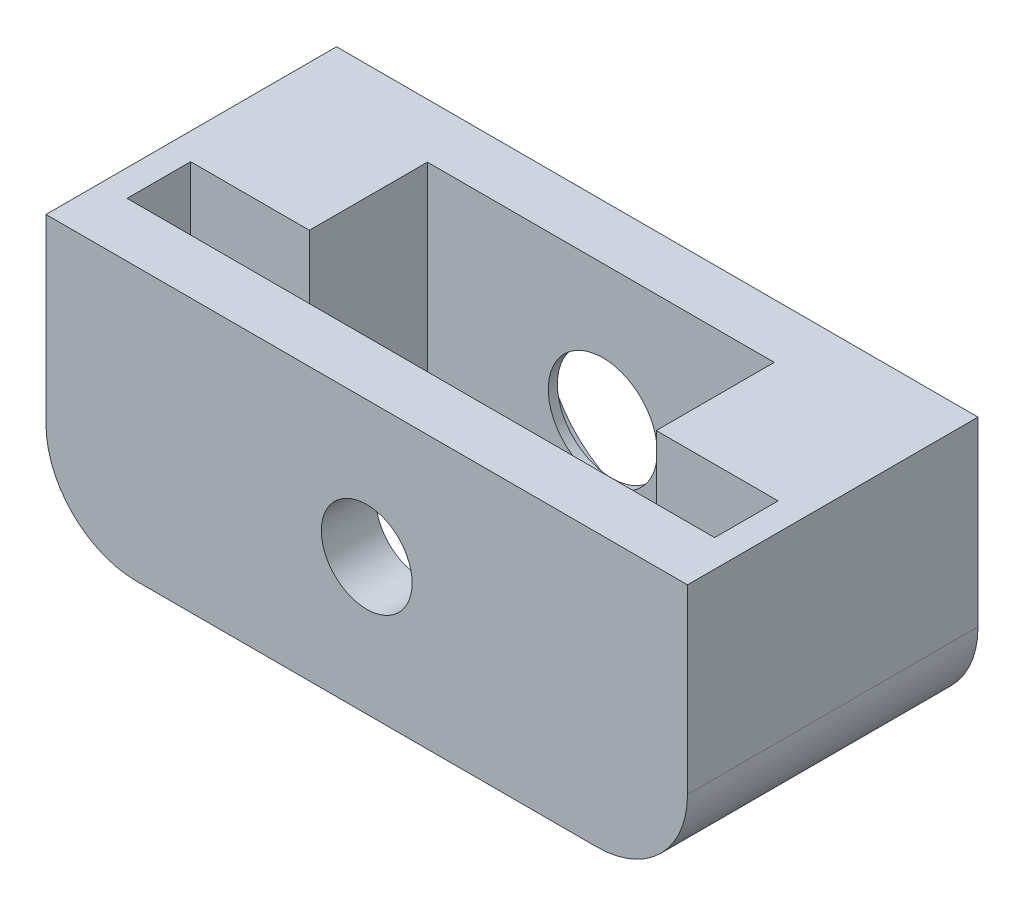
ISO-10303-21;
HEADER;
FILE_DESCRIPTION(('STEP AP214'),'2;1');
FILE_NAME('part.step','',(''),(''),'','','');
FILE_SCHEMA(('AUTOMOTIVE_DESIGN { 1 0 10303 214 1 1 1 1 }'));
ENDSEC;
DATA;
#1=APPLICATION_CONTEXT('core data for automotive mechanical design processes');
#2=APPLICATION_PROTOCOL_DEFINITION('international standard','automotive_design',2000,#1);
#3=PRODUCT_CONTEXT('',#1,'mechanical');
#4=PRODUCT('Part','Part','',(#3));
#5=PRODUCT_RELATED_PRODUCT_CATEGORY('part','',(#4));
#6=PRODUCT_DEFINITION_FORMATION('','',#4);
#7=PRODUCT_DEFINITION_CONTEXT('part definition',#1,'design');
#8=PRODUCT_DEFINITION('design','',#6,#7);
#9=PRODUCT_DEFINITION_SHAPE('','',#8);
#10=(LENGTH_UNIT() NAMED_UNIT(*) SI_UNIT(.MILLI.,.METRE.));
#11=(NAMED_UNIT(*) PLANE_ANGLE_UNIT() SI_UNIT($,.RADIAN.));
#12=(NAMED_UNIT(*) SI_UNIT($,.STERADIAN.) SOLID_ANGLE_UNIT());
#13=UNCERTAINTY_MEASURE_WITH_UNIT(LENGTH_MEASURE(1.E-05),#10,'distance_accuracy_value','');
#14=(GEOMETRIC_REPRESENTATION_CONTEXT(3) GLOBAL_UNCERTAINTY_ASSIGNED_CONTEXT((#13)) GLOBAL_UNIT_ASSIGNED_CONTEXT((#10,
#11,#12)) REPRESENTATION_CONTEXT('',''));
#15=CARTESIAN_POINT('',(0.,0.,0.));
#16=DIRECTION('',(0.,0.,1.));
#17=DIRECTION('',(1.,0.,0.));
#18=AXIS2_PLACEMENT_3D('',#15,#16,#17);
#19=CARTESIAN_POINT('',(7.23032744787133E-12,1.60982338570648E-12,-50.));
#20=DIRECTION('',(0.,0.,1.));
#21=DIRECTION('',(1.,0.,0.));
#22=AXIS2_PLACEMENT_3D('',#19,#20,#21);
#23=CYLINDRICAL_SURFACE('',#22,6.);
#24=CARTESIAN_POINT('',(7.23032744787133E-12,1.60982338570648E-12,-20.));
#25=DIRECTION('',(0.,0.,1.));
#26=DIRECTION('',(1.,0.,0.));
#27=AXIS2_PLACEMENT_3D('',#24,#25,#26);
#28=CIRCLE('',#27,6.);
#29=CARTESIAN_POINT('',(6.00000000000723,1.60982338570648E-12,-20.));
#30=VERTEX_POINT('',#29);
#31=EDGE_CURVE('E196',#30,#30,#28,.T.);
#32=ORIENTED_EDGE('',*,*,#31,.T.);
#33=EDGE_LOOP('',(#32));
#34=FACE_BOUND('',#33,.T.);
#35=CARTESIAN_POINT('',(7.23032744787133E-12,1.60982338570648E-12,-21.));
#36=DIRECTION('',(0.,0.,-1.));
#37=DIRECTION('',(-1.,0.,0.));
#38=AXIS2_PLACEMENT_3D('',#35,#36,#37);
#39=CIRCLE('',#38,6.);
#40=CARTESIAN_POINT('',(-5.99999999999277,1.60982338570648E-12,-21.));
#41=VERTEX_POINT('',#40);
#42=EDGE_CURVE('E39',#41,#41,#39,.F.);
#43=ORIENTED_EDGE('',*,*,#42,.F.);
#44=EDGE_LOOP('',(#43));
#45=FACE_BOUND('',#44,.T.);
#46=ADVANCED_FACE('F35',(#34,#45),#23,.F.);
#47=CARTESIAN_POINT('',(0.,0.,0.));
#48=DIRECTION('',(0.,0.,1.));
#49=DIRECTION('',(1.,0.,0.));
#50=AXIS2_PLACEMENT_3D('',#47,#48,#49);
#51=PLANE('',#50);
#52=CARTESIAN_POINT('',(0.,0.,0.));
#53=DIRECTION('',(0.,0.,-1.));
#54=DIRECTION('',(-1.,0.,0.));
#55=AXIS2_PLACEMENT_3D('',#52,#53,#54);
#56=CIRCLE('',#55,5.);
#57=CARTESIAN_POINT('',(-5.,0.,0.));
#58=VERTEX_POINT('',#57);
#59=EDGE_CURVE('E266',#58,#58,#56,.T.);
#60=ORIENTED_EDGE('',*,*,#59,.F.);
#61=EDGE_LOOP('',(#60));
#62=FACE_BOUND('',#61,.T.);
#63=DIRECTION('',(0.,-1.,0.));
#64=VECTOR('',#63,1.);
#65=CARTESIAN_POINT('',(-32.4010170504442,0.,0.));
#66=LINE('',#65,#64);
#67=CARTESIAN_POINT('',(-32.4010170504442,15.,0.));
#68=VERTEX_POINT('',#67);
#69=CARTESIAN_POINT('',(-32.4010170504442,-12.0710678118655,0.));
#70=VERTEX_POINT('',#69);
#71=EDGE_CURVE('E244',#68,#70,#66,.T.);
#72=ORIENTED_EDGE('',*,*,#71,.F.);
#73=DIRECTION('',(-1.,0.,0.));
#74=VECTOR('',#73,1.);
#75=CARTESIAN_POINT('',(-35.3299492385787,15.,0.));
#76=LINE('',#75,#74);
#77=CARTESIAN_POINT('',(32.3169988456541,15.,0.));
#78=VERTEX_POINT('',#77);
#79=EDGE_CURVE('E272',#78,#68,#76,.T.);
#80=ORIENTED_EDGE('',*,*,#79,.F.);
#81=DIRECTION('',(0.00310360125898917,-0.999995183818015,0.));
#82=VECTOR('',#81,1.);
#83=CARTESIAN_POINT('',(32.3632413519806,0.100443080357132,0.));
#84=LINE('',#83,#82);
#85=CARTESIAN_POINT('',(32.4010170504442,-12.0710678118655,0.));
#86=VERTEX_POINT('',#85);
#87=EDGE_CURVE('E256',#78,#86,#84,.T.);
#88=ORIENTED_EDGE('',*,*,#87,.T.);
#89=CARTESIAN_POINT('',(25.3299492385787,-5.,0.));
#90=DIRECTION('',(0.,0.,1.));
#91=DIRECTION('',(1.,0.,0.));
#92=AXIS2_PLACEMENT_3D('',#89,#90,#91);
#93=CIRCLE('',#92,10.);
#94=CARTESIAN_POINT('',(25.3299492385787,-15.,0.));
#95=VERTEX_POINT('',#94);
#96=EDGE_CURVE('E294',#86,#95,#93,.F.);
#97=ORIENTED_EDGE('',*,*,#96,.T.);
#98=DIRECTION('',(1.,0.,0.));
#99=VECTOR('',#98,1.);
#100=CARTESIAN_POINT('',(-35.3299492385787,-15.,0.));
#101=LINE('',#100,#99);
#102=CARTESIAN_POINT('',(-25.3299492385787,-15.,0.));
#103=VERTEX_POINT('',#102);
#104=EDGE_CURVE('E276',#103,#95,#101,.T.);
#105=ORIENTED_EDGE('',*,*,#104,.F.);
#106=CARTESIAN_POINT('',(-25.3299492385787,-5.,0.));
#107=DIRECTION('',(0.,0.,1.));
#108=DIRECTION('',(1.,0.,0.));
#109=AXIS2_PLACEMENT_3D('',#106,#107,#108);
#110=CIRCLE('',#109,10.);
#111=EDGE_CURVE('E292',#103,#70,#110,.F.);
#112=ORIENTED_EDGE('',*,*,#111,.T.);
#113=EDGE_LOOP('',(#72,#80,#88,#97,#105,#112));
#114=FACE_BOUND('',#113,.T.);
#115=ADVANCED_FACE('F342',(#62,#114),#51,.F.);
#116=CARTESIAN_POINT('',(35.3299492385787,15.,6.));
#117=DIRECTION('',(-1.,0.,0.));
#118=DIRECTION('',(0.,0.,1.));
#119=AXIS2_PLACEMENT_3D('',#116,#117,#118);
#120=PLANE('',#119);
#121=DIRECTION('',(0.,1.,0.));
#122=VECTOR('',#121,1.);
#123=CARTESIAN_POINT('',(35.3299492385787,15.,6.));
#124=LINE('',#123,#122);
#125=CARTESIAN_POINT('',(35.3299492385787,-4.99999999999999,6.));
#126=VERTEX_POINT('',#125);
#127=CARTESIAN_POINT('',(35.3299492385787,15.,6.));
#128=VERTEX_POINT('',#127);
#129=EDGE_CURVE('E273',#126,#128,#124,.T.);
#130=ORIENTED_EDGE('',*,*,#129,.F.);
#131=DIRECTION('',(0.,0.,-1.));
#132=VECTOR('',#131,1.);
#133=CARTESIAN_POINT('',(35.3299492385787,-5.,6.));
#134=LINE('',#133,#132);
#135=CARTESIAN_POINT('',(35.3299492385787,-4.99999999999999,-26.));
#136=VERTEX_POINT('',#135);
#137=EDGE_CURVE('E290',#126,#136,#134,.T.);
#138=ORIENTED_EDGE('',*,*,#137,.T.);
#139=DIRECTION('',(0.,-1.,0.));
#140=VECTOR('',#139,1.);
#141=CARTESIAN_POINT('',(35.3299492385787,15.,-26.));
#142=LINE('',#141,#140);
#143=CARTESIAN_POINT('',(35.3299492385787,15.,-26.));
#144=VERTEX_POINT('',#143);
#145=EDGE_CURVE('E200',#144,#136,#142,.T.);
#146=ORIENTED_EDGE('',*,*,#145,.F.);
#147=DIRECTION('',(0.,0.,-1.));
#148=VECTOR('',#147,1.);
#149=CARTESIAN_POINT('',(35.3299492385787,15.,6.));
#150=LINE('',#149,#148);
#151=EDGE_CURVE('E288',#128,#144,#150,.T.);
#152=ORIENTED_EDGE('',*,*,#151,.F.);
#153=EDGE_LOOP('',(#130,#138,#146,#152));
#154=FACE_BOUND('',#153,.T.);
#155=ADVANCED_FACE('F348',(#154),#120,.F.);
#156=CARTESIAN_POINT('',(-35.3299492385787,15.,6.));
#157=DIRECTION('',(0.,-1.,0.));
#158=DIRECTION('',(0.,0.,-1.));
#159=AXIS2_PLACEMENT_3D('',#156,#157,#158);
#160=PLANE('',#159);
#161=DIRECTION('',(0.,0.,1.));
#162=VECTOR('',#161,1.);
#163=CARTESIAN_POINT('',(-19.3178057319301,15.,-20.));
#164=LINE('',#163,#162);
#165=CARTESIAN_POINT('',(-19.3178057319301,15.,-20.));
#166=VERTEX_POINT('',#165);
#167=CARTESIAN_POINT('',(-19.3178057319301,15.,-7.));
#168=VERTEX_POINT('',#167);
#169=EDGE_CURVE('E241',#166,#168,#164,.T.);
#170=ORIENTED_EDGE('',*,*,#169,.F.);
#171=DIRECTION('',(1.,0.,0.));
#172=VECTOR('',#171,1.);
#173=CARTESIAN_POINT('',(-35.3299492385787,15.,-20.));
#174=LINE('',#173,#172);
#175=CARTESIAN_POINT('',(18.8893898911573,15.,-20.));
#176=VERTEX_POINT('',#175);
#177=EDGE_CURVE('E193',#166,#176,#174,.T.);
#178=ORIENTED_EDGE('',*,*,#177,.T.);
#179=DIRECTION('',(0.,0.,1.));
#180=VECTOR('',#179,1.);
#181=CARTESIAN_POINT('',(18.8893898911573,15.,-20.));
#182=LINE('',#181,#180);
#183=CARTESIAN_POINT('',(18.8893898911573,15.,-7.));
#184=VERTEX_POINT('',#183);
#185=EDGE_CURVE('E212',#176,#184,#182,.T.);
#186=ORIENTED_EDGE('',*,*,#185,.T.);
#187=DIRECTION('',(1.,0.,0.));
#188=VECTOR('',#187,1.);
#189=CARTESIAN_POINT('',(18.8893898911573,15.,-7.));
#190=LINE('',#189,#188);
#191=CARTESIAN_POINT('',(32.3169988456541,15.,-7.));
#192=VERTEX_POINT('',#191);
#193=EDGE_CURVE('E213',#184,#192,#190,.T.);
#194=ORIENTED_EDGE('',*,*,#193,.T.);
#195=DIRECTION('',(0.,0.,1.));
#196=VECTOR('',#195,1.);
#197=CARTESIAN_POINT('',(32.3169988456541,15.,-7.));
#198=LINE('',#197,#196);
#199=EDGE_CURVE('E264',#192,#78,#198,.T.);
#200=ORIENTED_EDGE('',*,*,#199,.T.);
#201=ORIENTED_EDGE('',*,*,#79,.T.);
#202=DIRECTION('',(0.,0.,1.));
#203=VECTOR('',#202,1.);
#204=CARTESIAN_POINT('',(-32.4010170504442,15.,-7.));
#205=LINE('',#204,#203);
#206=CARTESIAN_POINT('',(-32.4010170504442,15.,-7.));
#207=VERTEX_POINT('',#206);
#208=EDGE_CURVE('E253',#207,#68,#205,.T.);
#209=ORIENTED_EDGE('',*,*,#208,.F.);
#210=DIRECTION('',(1.,0.,0.));
#211=VECTOR('',#210,1.);
#212=CARTESIAN_POINT('',(-35.3299492385787,15.,-7.));
#213=LINE('',#212,#211);
#214=EDGE_CURVE('E234',#207,#168,#213,.T.);
#215=ORIENTED_EDGE('',*,*,#214,.T.);
#216=EDGE_LOOP('',(#170,#178,#186,#194,#200,#201,#209,#215));
#217=FACE_BOUND('',#216,.T.);
#218=ORIENTED_EDGE('',*,*,#151,.T.);
#219=DIRECTION('',(1.,0.,0.));
#220=VECTOR('',#219,1.);
#221=CARTESIAN_POINT('',(-35.3299492385787,15.,-26.));
#222=LINE('',#221,#220);
#223=CARTESIAN_POINT('',(-35.3299492385787,15.,-26.));
#224=VERTEX_POINT('',#223);
#225=EDGE_CURVE('E184',#224,#144,#222,.T.);
#226=ORIENTED_EDGE('',*,*,#225,.F.);
#227=DIRECTION('',(0.,0.,-1.));
#228=VECTOR('',#227,1.);
#229=CARTESIAN_POINT('',(-35.3299492385787,15.,6.));
#230=LINE('',#229,#228);
#231=CARTESIAN_POINT('',(-35.3299492385787,15.,6.));
#232=VERTEX_POINT('',#231);
#233=EDGE_CURVE('E180',#232,#224,#230,.T.);
#234=ORIENTED_EDGE('',*,*,#233,.F.);
#235=DIRECTION('',(-1.,0.,0.));
#236=VECTOR('',#235,1.);
#237=CARTESIAN_POINT('',(-35.3299492385787,15.,6.));
#238=LINE('',#237,#236);
#239=EDGE_CURVE('E275',#128,#232,#238,.T.);
#240=ORIENTED_EDGE('',*,*,#239,.F.);
#241=EDGE_LOOP('',(#218,#226,#234,#240));
#242=FACE_BOUND('',#241,.T.);
#243=ADVANCED_FACE('F325',(#217,#242),#160,.F.);
#244=CARTESIAN_POINT('',(-35.3299492385787,15.,6.));
#245=DIRECTION('',(1.,0.,0.));
#246=DIRECTION('',(0.,0.,-1.));
#247=AXIS2_PLACEMENT_3D('',#244,#245,#246);
#248=PLANE('',#247);
#249=ORIENTED_EDGE('',*,*,#233,.T.);
#250=DIRECTION('',(0.,1.,0.));
#251=VECTOR('',#250,1.);
#252=CARTESIAN_POINT('',(-35.3299492385787,-4.99999999999999,-26.));
#253=LINE('',#252,#251);
#254=CARTESIAN_POINT('',(-35.3299492385787,-4.99999999999999,-26.));
#255=VERTEX_POINT('',#254);
#256=EDGE_CURVE('E177',#255,#224,#253,.T.);
#257=ORIENTED_EDGE('',*,*,#256,.F.);
#258=DIRECTION('',(0.,0.,-1.));
#259=VECTOR('',#258,1.);
#260=CARTESIAN_POINT('',(-35.3299492385787,-5.,6.));
#261=LINE('',#260,#259);
#262=CARTESIAN_POINT('',(-35.3299492385787,-4.99999999999999,6.));
#263=VERTEX_POINT('',#262);
#264=EDGE_CURVE('E162',#255,#263,#261,.F.);
#265=ORIENTED_EDGE('',*,*,#264,.T.);
#266=DIRECTION('',(0.,-1.,0.));
#267=VECTOR('',#266,1.);
#268=CARTESIAN_POINT('',(-35.3299492385787,15.,6.));
#269=LINE('',#268,#267);
#270=EDGE_CURVE('E278',#232,#263,#269,.T.);
#271=ORIENTED_EDGE('',*,*,#270,.F.);
#272=EDGE_LOOP('',(#249,#257,#265,#271));
#273=FACE_BOUND('',#272,.T.);
#274=ADVANCED_FACE('F178',(#273),#248,.F.);
#275=CARTESIAN_POINT('',(-35.3299492385787,-15.,6.));
#276=DIRECTION('',(0.,1.,0.));
#277=DIRECTION('',(0.,0.,1.));
#278=AXIS2_PLACEMENT_3D('',#275,#276,#277);
#279=PLANE('',#278);
#280=ORIENTED_EDGE('',*,*,#104,.T.);
#281=DIRECTION('',(0.,0.,-1.));
#282=VECTOR('',#281,1.);
#283=CARTESIAN_POINT('',(25.3299492385787,-15.,6.));
#284=LINE('',#283,#282);
#285=CARTESIAN_POINT('',(25.3299492385787,-15.,6.));
#286=VERTEX_POINT('',#285);
#287=EDGE_CURVE('E299',#95,#286,#284,.F.);
#288=ORIENTED_EDGE('',*,*,#287,.T.);
#289=DIRECTION('',(1.,0.,0.));
#290=VECTOR('',#289,1.);
#291=CARTESIAN_POINT('',(-35.3299492385787,-15.,6.));
#292=LINE('',#291,#290);
#293=CARTESIAN_POINT('',(-25.3299492385787,-15.,6.));
#294=VERTEX_POINT('',#293);
#295=EDGE_CURVE('E280',#294,#286,#292,.T.);
#296=ORIENTED_EDGE('',*,*,#295,.F.);
#297=DIRECTION('',(0.,0.,-1.));
#298=VECTOR('',#297,1.);
#299=CARTESIAN_POINT('',(-25.3299492385787,-15.,6.));
#300=LINE('',#299,#298);
#301=EDGE_CURVE('E296',#294,#103,#300,.T.);
#302=ORIENTED_EDGE('',*,*,#301,.T.);
#303=EDGE_LOOP('',(#280,#288,#296,#302));
#304=FACE_BOUND('',#303,.T.);
#305=ADVANCED_FACE('F391',(#304),#279,.F.);
#306=CARTESIAN_POINT('',(0.,0.,6.));
#307=DIRECTION('',(0.,0.,1.));
#308=DIRECTION('',(1.,0.,0.));
#309=AXIS2_PLACEMENT_3D('',#306,#307,#308);
#310=PLANE('',#309);
#311=CARTESIAN_POINT('',(0.,0.,6.));
#312=DIRECTION('',(0.,0.,1.));
#313=DIRECTION('',(1.,0.,0.));
#314=AXIS2_PLACEMENT_3D('',#311,#312,#313);
#315=CIRCLE('',#314,5.);
#316=CARTESIAN_POINT('',(5.,0.,6.));
#317=VERTEX_POINT('',#316);
#318=EDGE_CURVE('E269',#317,#317,#315,.T.);
#319=ORIENTED_EDGE('',*,*,#318,.F.);
#320=EDGE_LOOP('',(#319));
#321=FACE_BOUND('',#320,.T.);
#322=ORIENTED_EDGE('',*,*,#295,.T.);
#323=CARTESIAN_POINT('',(25.3299492385787,-5.,6.));
#324=DIRECTION('',(0.,0.,1.));
#325=DIRECTION('',(1.,0.,0.));
#326=AXIS2_PLACEMENT_3D('',#323,#324,#325);
#327=CIRCLE('',#326,10.);
#328=EDGE_CURVE('E174',#286,#126,#327,.T.);
#329=ORIENTED_EDGE('',*,*,#328,.T.);
#330=ORIENTED_EDGE('',*,*,#129,.T.);
#331=ORIENTED_EDGE('',*,*,#239,.T.);
#332=ORIENTED_EDGE('',*,*,#270,.T.);
#333=CARTESIAN_POINT('',(-25.3299492385787,-5.,6.));
#334=DIRECTION('',(0.,0.,1.));
#335=DIRECTION('',(1.,0.,0.));
#336=AXIS2_PLACEMENT_3D('',#333,#334,#335);
#337=CIRCLE('',#336,10.);
#338=EDGE_CURVE('E169',#263,#294,#337,.T.);
#339=ORIENTED_EDGE('',*,*,#338,.T.);
#340=EDGE_LOOP('',(#322,#329,#330,#331,#332,#339));
#341=FACE_BOUND('',#340,.T.);
#342=ADVANCED_FACE('F388',(#321,#341),#310,.T.);
#343=CARTESIAN_POINT('',(0.,0.,10.));
#344=DIRECTION('',(0.,0.,-1.));
#345=DIRECTION('',(-1.,0.,0.));
#346=AXIS2_PLACEMENT_3D('',#343,#344,#345);
#347=CYLINDRICAL_SURFACE('',#346,5.);
#348=ORIENTED_EDGE('',*,*,#318,.T.);
#349=EDGE_LOOP('',(#348));
#350=FACE_BOUND('',#349,.T.);
#351=ORIENTED_EDGE('',*,*,#59,.T.);
#352=EDGE_LOOP('',(#351));
#353=FACE_BOUND('',#352,.T.);
#354=ADVANCED_FACE('F384',(#350,#353),#347,.F.);
#355=CARTESIAN_POINT('',(25.3299492385787,-5.,6.));
#356=DIRECTION('',(0.,0.,-1.));
#357=DIRECTION('',(-1.,0.,0.));
#358=AXIS2_PLACEMENT_3D('',#355,#356,#357);
#359=CYLINDRICAL_SURFACE('',#358,10.);
#360=ORIENTED_EDGE('',*,*,#328,.F.);
#361=ORIENTED_EDGE('',*,*,#287,.F.);
#362=ORIENTED_EDGE('',*,*,#96,.F.);
#363=DIRECTION('',(0.,0.,1.));
#364=VECTOR('',#363,1.);
#365=CARTESIAN_POINT('',(32.4010170504442,-12.0710678118655,-7.));
#366=LINE('',#365,#364);
#367=CARTESIAN_POINT('',(32.4010170504442,-12.0710678118655,-7.));
#368=VERTEX_POINT('',#367);
#369=EDGE_CURVE('E260',#368,#86,#366,.T.);
#370=ORIENTED_EDGE('',*,*,#369,.F.);
#371=CARTESIAN_POINT('',(25.3299492385787,-5.,-7.));
#372=DIRECTION('',(0.,0.,-1.));
#373=DIRECTION('',(-1.,0.,0.));
#374=AXIS2_PLACEMENT_3D('',#371,#372,#373);
#375=CIRCLE('',#374,10.);
#376=CARTESIAN_POINT('',(25.3299492385787,-15.,-7.));
#377=VERTEX_POINT('',#376);
#378=EDGE_CURVE('E206',#368,#377,#375,.T.);
#379=ORIENTED_EDGE('',*,*,#378,.T.);
#380=DIRECTION('',(0.,0.,1.));
#381=VECTOR('',#380,1.);
#382=CARTESIAN_POINT('',(25.3299492385787,-15.,-20.));
#383=LINE('',#382,#381);
#384=CARTESIAN_POINT('',(25.3299492385787,-15.,-26.));
#385=VERTEX_POINT('',#384);
#386=EDGE_CURVE('E223',#385,#377,#383,.T.);
#387=ORIENTED_EDGE('',*,*,#386,.F.);
#388=CARTESIAN_POINT('',(25.3299492385787,-5.,-26.));
#389=DIRECTION('',(0.,0.,-1.));
#390=DIRECTION('',(-1.,0.,0.));
#391=AXIS2_PLACEMENT_3D('',#388,#389,#390);
#392=CIRCLE('',#391,10.);
#393=EDGE_CURVE('E203',#136,#385,#392,.T.);
#394=ORIENTED_EDGE('',*,*,#393,.F.);
#395=ORIENTED_EDGE('',*,*,#137,.F.);
#396=EDGE_LOOP('',(#360,#361,#362,#370,#379,#387,#394,#395));
#397=FACE_BOUND('',#396,.T.);
#398=ADVANCED_FACE('F387',(#397),#359,.T.);
#399=CARTESIAN_POINT('',(-25.3299492385787,-5.,6.));
#400=DIRECTION('',(0.,0.,-1.));
#401=DIRECTION('',(-1.,0.,0.));
#402=AXIS2_PLACEMENT_3D('',#399,#400,#401);
#403=CYLINDRICAL_SURFACE('',#402,10.);
#404=ORIENTED_EDGE('',*,*,#338,.F.);
#405=ORIENTED_EDGE('',*,*,#264,.F.);
#406=CARTESIAN_POINT('',(-25.3299492385787,-5.,-26.));
#407=DIRECTION('',(0.,0.,-1.));
#408=DIRECTION('',(-1.,0.,0.));
#409=AXIS2_PLACEMENT_3D('',#406,#407,#408);
#410=CIRCLE('',#409,10.);
#411=CARTESIAN_POINT('',(-25.3299492385787,-15.,-26.));
#412=VERTEX_POINT('',#411);
#413=EDGE_CURVE('E167',#412,#255,#410,.T.);
#414=ORIENTED_EDGE('',*,*,#413,.F.);
#415=DIRECTION('',(0.,0.,1.));
#416=VECTOR('',#415,1.);
#417=CARTESIAN_POINT('',(-25.3299492385787,-15.,-20.));
#418=LINE('',#417,#416);
#419=CARTESIAN_POINT('',(-25.3299492385787,-15.,-7.));
#420=VERTEX_POINT('',#419);
#421=EDGE_CURVE('E230',#412,#420,#418,.T.);
#422=ORIENTED_EDGE('',*,*,#421,.T.);
#423=CARTESIAN_POINT('',(-25.3299492385787,-5.,-7.));
#424=DIRECTION('',(0.,0.,-1.));
#425=DIRECTION('',(-1.,0.,0.));
#426=AXIS2_PLACEMENT_3D('',#423,#424,#425);
#427=CIRCLE('',#426,10.);
#428=CARTESIAN_POINT('',(-32.4010170504442,-12.0710678118655,-7.));
#429=VERTEX_POINT('',#428);
#430=EDGE_CURVE('E226',#420,#429,#427,.T.);
#431=ORIENTED_EDGE('',*,*,#430,.T.);
#432=DIRECTION('',(0.,0.,1.));
#433=VECTOR('',#432,1.);
#434=CARTESIAN_POINT('',(-32.4010170504442,-12.0710678118655,-7.));
#435=LINE('',#434,#433);
#436=EDGE_CURVE('E248',#429,#70,#435,.T.);
#437=ORIENTED_EDGE('',*,*,#436,.T.);
#438=ORIENTED_EDGE('',*,*,#111,.F.);
#439=ORIENTED_EDGE('',*,*,#301,.F.);
#440=EDGE_LOOP('',(#404,#405,#414,#422,#431,#437,#438,#439));
#441=FACE_BOUND('',#440,.T.);
#442=ADVANCED_FACE('F164',(#441),#403,.T.);
#443=CARTESIAN_POINT('',(32.3632413519806,0.100443080357132,-7.));
#444=DIRECTION('',(-0.999995183818015,-0.00310360125898917,0.));
#445=DIRECTION('',(0.00310360125898917,-0.999995183818015,0.));
#446=AXIS2_PLACEMENT_3D('',#443,#444,#445);
#447=PLANE('',#446);
#448=ORIENTED_EDGE('',*,*,#87,.F.);
#449=ORIENTED_EDGE('',*,*,#199,.F.);
#450=DIRECTION('',(0.00310360125898917,-0.999995183818015,0.));
#451=VECTOR('',#450,1.);
#452=CARTESIAN_POINT('',(32.3632413519806,0.100443080357132,-7.));
#453=LINE('',#452,#451);
#454=EDGE_CURVE('E257',#192,#368,#453,.T.);
#455=ORIENTED_EDGE('',*,*,#454,.T.);
#456=ORIENTED_EDGE('',*,*,#369,.T.);
#457=EDGE_LOOP('',(#448,#449,#455,#456));
#458=FACE_BOUND('',#457,.T.);
#459=ADVANCED_FACE('F379',(#458),#447,.T.);
#460=CARTESIAN_POINT('',(-32.4010170504442,0.,-7.));
#461=DIRECTION('',(-1.,0.,0.));
#462=DIRECTION('',(0.,0.,1.));
#463=AXIS2_PLACEMENT_3D('',#460,#461,#462);
#464=PLANE('',#463);
#465=ORIENTED_EDGE('',*,*,#71,.T.);
#466=ORIENTED_EDGE('',*,*,#436,.F.);
#467=DIRECTION('',(0.,-1.,0.));
#468=VECTOR('',#467,1.);
#469=CARTESIAN_POINT('',(-32.4010170504442,0.,-7.));
#470=LINE('',#469,#468);
#471=EDGE_CURVE('E245',#207,#429,#470,.T.);
#472=ORIENTED_EDGE('',*,*,#471,.F.);
#473=ORIENTED_EDGE('',*,*,#208,.T.);
#474=EDGE_LOOP('',(#465,#466,#472,#473));
#475=FACE_BOUND('',#474,.T.);
#476=ADVANCED_FACE('F370',(#475),#464,.F.);
#477=CARTESIAN_POINT('',(-25.3299492385787,-5.,-7.));
#478=DIRECTION('',(0.,0.,-1.));
#479=DIRECTION('',(-1.,0.,0.));
#480=AXIS2_PLACEMENT_3D('',#477,#478,#479);
#481=PLANE('',#480);
#482=DIRECTION('',(-1.,0.,0.));
#483=VECTOR('',#482,1.);
#484=CARTESIAN_POINT('',(-19.3178057319301,-15.,-7.));
#485=LINE('',#484,#483);
#486=CARTESIAN_POINT('',(-25.3178057319301,-15.,-7.));
#487=VERTEX_POINT('',#486);
#488=EDGE_CURVE('E231',#487,#420,#485,.T.);
#489=ORIENTED_EDGE('',*,*,#488,.F.);
#490=CARTESIAN_POINT('',(-25.3178057319301,-9.,-7.));
#491=DIRECTION('',(0.,0.,-1.));
#492=DIRECTION('',(-1.,0.,0.));
#493=AXIS2_PLACEMENT_3D('',#490,#491,#492);
#494=CIRCLE('',#493,6.);
#495=CARTESIAN_POINT('',(-19.3178057319301,-9.,-7.));
#496=VERTEX_POINT('',#495);
#497=EDGE_CURVE('E305',#487,#496,#494,.F.);
#498=ORIENTED_EDGE('',*,*,#497,.T.);
#499=DIRECTION('',(0.,-1.,0.));
#500=VECTOR('',#499,1.);
#501=CARTESIAN_POINT('',(-19.3178057319301,15.,-7.));
#502=LINE('',#501,#500);
#503=EDGE_CURVE('E236',#168,#496,#502,.T.);
#504=ORIENTED_EDGE('',*,*,#503,.F.);
#505=ORIENTED_EDGE('',*,*,#214,.F.);
#506=ORIENTED_EDGE('',*,*,#471,.T.);
#507=ORIENTED_EDGE('',*,*,#430,.F.);
#508=EDGE_LOOP('',(#489,#498,#504,#505,#506,#507));
#509=FACE_BOUND('',#508,.T.);
#510=ADVANCED_FACE('F366',(#509),#481,.F.);
#511=CARTESIAN_POINT('',(-19.3178057319301,15.,-20.));
#512=DIRECTION('',(-1.,0.,0.));
#513=DIRECTION('',(0.,-1.,0.));
#514=AXIS2_PLACEMENT_3D('',#511,#512,#513);
#515=PLANE('',#514);
#516=ORIENTED_EDGE('',*,*,#503,.T.);
#517=DIRECTION('',(0.,0.,1.));
#518=VECTOR('',#517,1.);
#519=CARTESIAN_POINT('',(-19.3178057319301,-9.,-20.));
#520=LINE('',#519,#518);
#521=CARTESIAN_POINT('',(-19.3178057319301,-9.,-20.));
#522=VERTEX_POINT('',#521);
#523=EDGE_CURVE('E307',#496,#522,#520,.F.);
#524=ORIENTED_EDGE('',*,*,#523,.T.);
#525=DIRECTION('',(0.,-1.,0.));
#526=VECTOR('',#525,1.);
#527=CARTESIAN_POINT('',(-19.3178057319301,15.,-20.));
#528=LINE('',#527,#526);
#529=EDGE_CURVE('E227',#166,#522,#528,.T.);
#530=ORIENTED_EDGE('',*,*,#529,.F.);
#531=ORIENTED_EDGE('',*,*,#169,.T.);
#532=EDGE_LOOP('',(#516,#524,#530,#531));
#533=FACE_BOUND('',#532,.T.);
#534=ADVANCED_FACE('F369',(#533),#515,.F.);
#535=CARTESIAN_POINT('',(-19.3178057319301,-15.,-20.));
#536=DIRECTION('',(0.,1.,0.));
#537=DIRECTION('',(-1.,0.,0.));
#538=AXIS2_PLACEMENT_3D('',#535,#536,#537);
#539=PLANE('',#538);
#540=ORIENTED_EDGE('',*,*,#421,.F.);
#541=DIRECTION('',(-1.,0.,0.));
#542=VECTOR('',#541,1.);
#543=CARTESIAN_POINT('',(25.3299492385787,-15.,-26.));
#544=LINE('',#543,#542);
#545=EDGE_CURVE('E190',#385,#412,#544,.T.);
#546=ORIENTED_EDGE('',*,*,#545,.F.);
#547=ORIENTED_EDGE('',*,*,#386,.T.);
#548=DIRECTION('',(-1.,0.,0.));
#549=VECTOR('',#548,1.);
#550=CARTESIAN_POINT('',(25.3299492385787,-15.,-7.));
#551=LINE('',#550,#549);
#552=CARTESIAN_POINT('',(24.8893898911573,-15.,-7.));
#553=VERTEX_POINT('',#552);
#554=EDGE_CURVE('E215',#377,#553,#551,.T.);
#555=ORIENTED_EDGE('',*,*,#554,.T.);
#556=DIRECTION('',(0.,0.,1.));
#557=VECTOR('',#556,1.);
#558=CARTESIAN_POINT('',(24.8893898911573,-15.,-20.));
#559=LINE('',#558,#557);
#560=CARTESIAN_POINT('',(24.8893898911573,-15.,-20.));
#561=VERTEX_POINT('',#560);
#562=EDGE_CURVE('E44',#553,#561,#559,.F.);
#563=ORIENTED_EDGE('',*,*,#562,.T.);
#564=DIRECTION('',(-1.,0.,0.));
#565=VECTOR('',#564,1.);
#566=CARTESIAN_POINT('',(25.3299492385787,-15.,-20.));
#567=LINE('',#566,#565);
#568=CARTESIAN_POINT('',(-25.3178057319301,-15.,-20.));
#569=VERTEX_POINT('',#568);
#570=EDGE_CURVE('E191',#561,#569,#567,.T.);
#571=ORIENTED_EDGE('',*,*,#570,.T.);
#572=DIRECTION('',(0.,0.,1.));
#573=VECTOR('',#572,1.);
#574=CARTESIAN_POINT('',(-25.3178057319301,-15.,-20.));
#575=LINE('',#574,#573);
#576=EDGE_CURVE('E173',#569,#487,#575,.T.);
#577=ORIENTED_EDGE('',*,*,#576,.T.);
#578=ORIENTED_EDGE('',*,*,#488,.T.);
#579=EDGE_LOOP('',(#540,#546,#547,#555,#563,#571,#577,#578));
#580=FACE_BOUND('',#579,.T.);
#581=ADVANCED_FACE('F365',(#580),#539,.F.);
#582=CARTESIAN_POINT('',(18.8893898911573,15.,-20.));
#583=DIRECTION('',(1.,0.,0.));
#584=DIRECTION('',(0.,0.,-1.));
#585=AXIS2_PLACEMENT_3D('',#582,#583,#584);
#586=PLANE('',#585);
#587=DIRECTION('',(0.,1.,0.));
#588=VECTOR('',#587,1.);
#589=CARTESIAN_POINT('',(18.8893898911573,15.,-20.));
#590=LINE('',#589,#588);
#591=CARTESIAN_POINT('',(18.8893898911573,-9.,-20.));
#592=VERTEX_POINT('',#591);
#593=EDGE_CURVE('E209',#592,#176,#590,.T.);
#594=ORIENTED_EDGE('',*,*,#593,.F.);
#595=DIRECTION('',(0.,0.,1.));
#596=VECTOR('',#595,1.);
#597=CARTESIAN_POINT('',(18.8893898911573,-9.,-20.));
#598=LINE('',#597,#596);
#599=CARTESIAN_POINT('',(18.8893898911573,-9.,-7.));
#600=VERTEX_POINT('',#599);
#601=EDGE_CURVE('E312',#592,#600,#598,.T.);
#602=ORIENTED_EDGE('',*,*,#601,.T.);
#603=DIRECTION('',(0.,1.,0.));
#604=VECTOR('',#603,1.);
#605=CARTESIAN_POINT('',(18.8893898911573,15.,-7.));
#606=LINE('',#605,#604);
#607=EDGE_CURVE('E217',#600,#184,#606,.T.);
#608=ORIENTED_EDGE('',*,*,#607,.T.);
#609=ORIENTED_EDGE('',*,*,#185,.F.);
#610=EDGE_LOOP('',(#594,#602,#608,#609));
#611=FACE_BOUND('',#610,.T.);
#612=ADVANCED_FACE('F318',(#611),#586,.F.);
#613=CARTESIAN_POINT('',(25.3299492385787,-5.,-7.));
#614=DIRECTION('',(0.,0.,-1.));
#615=DIRECTION('',(-1.,0.,0.));
#616=AXIS2_PLACEMENT_3D('',#613,#614,#615);
#617=PLANE('',#616);
#618=ORIENTED_EDGE('',*,*,#607,.F.);
#619=CARTESIAN_POINT('',(24.8893898911573,-9.,-7.));
#620=DIRECTION('',(0.,0.,-1.));
#621=DIRECTION('',(-1.,0.,0.));
#622=AXIS2_PLACEMENT_3D('',#619,#620,#621);
#623=CIRCLE('',#622,6.);
#624=EDGE_CURVE('E58',#600,#553,#623,.F.);
#625=ORIENTED_EDGE('',*,*,#624,.T.);
#626=ORIENTED_EDGE('',*,*,#554,.F.);
#627=ORIENTED_EDGE('',*,*,#378,.F.);
#628=ORIENTED_EDGE('',*,*,#454,.F.);
#629=ORIENTED_EDGE('',*,*,#193,.F.);
#630=EDGE_LOOP('',(#618,#625,#626,#627,#628,#629));
#631=FACE_BOUND('',#630,.T.);
#632=ADVANCED_FACE('F321',(#631),#617,.F.);
#633=CARTESIAN_POINT('',(-25.3178057319301,-9.,-20.));
#634=DIRECTION('',(0.,0.,1.));
#635=DIRECTION('',(1.,0.,0.));
#636=AXIS2_PLACEMENT_3D('',#633,#634,#635);
#637=CYLINDRICAL_SURFACE('',#636,6.);
#638=CARTESIAN_POINT('',(-25.3178057319301,-9.,-20.));
#639=DIRECTION('',(0.,0.,-1.));
#640=DIRECTION('',(-1.,0.,0.));
#641=AXIS2_PLACEMENT_3D('',#638,#639,#640);
#642=CIRCLE('',#641,6.);
#643=EDGE_CURVE('E309',#522,#569,#642,.T.);
#644=ORIENTED_EDGE('',*,*,#643,.F.);
#645=ORIENTED_EDGE('',*,*,#523,.F.);
#646=ORIENTED_EDGE('',*,*,#497,.F.);
#647=ORIENTED_EDGE('',*,*,#576,.F.);
#648=EDGE_LOOP('',(#644,#645,#646,#647));
#649=FACE_BOUND('',#648,.T.);
#650=ADVANCED_FACE('F333',(#649),#637,.T.);
#651=CARTESIAN_POINT('',(24.8893898911573,-9.,-20.));
#652=DIRECTION('',(0.,0.,1.));
#653=DIRECTION('',(1.,0.,0.));
#654=AXIS2_PLACEMENT_3D('',#651,#652,#653);
#655=CYLINDRICAL_SURFACE('',#654,6.);
#656=CARTESIAN_POINT('',(24.8893898911573,-9.,-20.));
#657=DIRECTION('',(0.,0.,-1.));
#658=DIRECTION('',(-1.,0.,0.));
#659=AXIS2_PLACEMENT_3D('',#656,#657,#658);
#660=CIRCLE('',#659,6.);
#661=EDGE_CURVE('E11',#561,#592,#660,.T.);
#662=ORIENTED_EDGE('',*,*,#661,.F.);
#663=ORIENTED_EDGE('',*,*,#562,.F.);
#664=ORIENTED_EDGE('',*,*,#624,.F.);
#665=ORIENTED_EDGE('',*,*,#601,.F.);
#666=EDGE_LOOP('',(#662,#663,#664,#665));
#667=FACE_BOUND('',#666,.T.);
#668=ADVANCED_FACE('F37',(#667),#655,.T.);
#669=CARTESIAN_POINT('',(-25.3299492385787,-5.,-20.));
#670=DIRECTION('',(0.,0.,-1.));
#671=DIRECTION('',(-1.,0.,0.));
#672=AXIS2_PLACEMENT_3D('',#669,#670,#671);
#673=PLANE('',#672);
#674=ORIENTED_EDGE('',*,*,#31,.F.);
#675=EDGE_LOOP('',(#674));
#676=FACE_BOUND('',#675,.T.);
#677=ORIENTED_EDGE('',*,*,#177,.F.);
#678=ORIENTED_EDGE('',*,*,#529,.T.);
#679=ORIENTED_EDGE('',*,*,#643,.T.);
#680=ORIENTED_EDGE('',*,*,#570,.F.);
#681=ORIENTED_EDGE('',*,*,#661,.T.);
#682=ORIENTED_EDGE('',*,*,#593,.T.);
#683=EDGE_LOOP('',(#677,#678,#679,#680,#681,#682));
#684=FACE_BOUND('',#683,.T.);
#685=ADVANCED_FACE('F330',(#676,#684),#673,.F.);
#686=CARTESIAN_POINT('',(-25.3299492385787,-5.,-26.));
#687=DIRECTION('',(0.,0.,-1.));
#688=DIRECTION('',(-1.,0.,0.));
#689=AXIS2_PLACEMENT_3D('',#686,#687,#688);
#690=PLANE('',#689);
#691=CARTESIAN_POINT('',(7.23032744787133E-12,1.60982338570648E-12,-26.));
#692=DIRECTION('',(0.,0.,-1.));
#693=DIRECTION('',(-1.,0.,0.));
#694=AXIS2_PLACEMENT_3D('',#691,#692,#693);
#695=CIRCLE('',#694,12.5);
#696=CARTESIAN_POINT('',(-12.4999999999928,1.60982338570648E-12,-26.));
#697=VERTEX_POINT('',#696);
#698=EDGE_CURVE('E493',#697,#697,#695,.T.);
#699=ORIENTED_EDGE('',*,*,#698,.F.);
#700=EDGE_LOOP('',(#699));
#701=FACE_BOUND('',#700,.T.);
#702=ORIENTED_EDGE('',*,*,#413,.T.);
#703=ORIENTED_EDGE('',*,*,#256,.T.);
#704=ORIENTED_EDGE('',*,*,#225,.T.);
#705=ORIENTED_EDGE('',*,*,#145,.T.);
#706=ORIENTED_EDGE('',*,*,#393,.T.);
#707=ORIENTED_EDGE('',*,*,#545,.T.);
#708=EDGE_LOOP('',(#702,#703,#704,#705,#706,#707));
#709=FACE_BOUND('',#708,.T.);
#710=ADVANCED_FACE('F187',(#701,#709),#690,.T.);
#711=CARTESIAN_POINT('',(7.23032744787133E-12,1.60982338570648E-12,-21.));
#712=DIRECTION('',(0.,0.,-1.));
#713=DIRECTION('',(-1.,0.,0.));
#714=AXIS2_PLACEMENT_3D('',#711,#712,#713);
#715=PLANE('',#714);
#716=CARTESIAN_POINT('',(7.23032744787133E-12,1.60982338570648E-12,-21.));
#717=DIRECTION('',(0.,0.,-1.));
#718=DIRECTION('',(-1.,0.,0.));
#719=AXIS2_PLACEMENT_3D('',#716,#717,#718);
#720=CIRCLE('',#719,12.5);
#721=CARTESIAN_POINT('',(-12.4999999999928,1.60982338570648E-12,-21.));
#722=VERTEX_POINT('',#721);
#723=EDGE_CURVE('E490',#722,#722,#720,.T.);
#724=ORIENTED_EDGE('',*,*,#723,.T.);
#725=EDGE_LOOP('',(#724));
#726=FACE_BOUND('',#725,.T.);
#727=ORIENTED_EDGE('',*,*,#42,.T.);
#728=EDGE_LOOP('',(#727));
#729=FACE_BOUND('',#728,.T.);
#730=ADVANCED_FACE('F358',(#726,#729),#715,.T.);
#731=CARTESIAN_POINT('',(7.23032744787133E-12,1.60982338570648E-12,-21.));
#732=DIRECTION('',(0.,0.,-1.));
#733=DIRECTION('',(-1.,0.,0.));
#734=AXIS2_PLACEMENT_3D('',#731,#732,#733);
#735=CYLINDRICAL_SURFACE('',#734,12.5);
#736=ORIENTED_EDGE('',*,*,#723,.F.);
#737=EDGE_LOOP('',(#736));
#738=FACE_BOUND('',#737,.T.);
#739=ORIENTED_EDGE('',*,*,#698,.T.);
#740=EDGE_LOOP('',(#739));
#741=FACE_BOUND('',#740,.T.);
#742=ADVANCED_FACE('F355',(#738,#741),#735,.F.);
#743=CLOSED_SHELL('',(#46,#115,#155,#243,#274,#305,#342,#354,#398,#442,#459,#476,#510,#534,#581,
#612,#632,#650,#668,#685,#710,#730,#742));
#744=MANIFOLD_SOLID_BREP('B2',#743);
#745=ADVANCED_BREP_SHAPE_REPRESENTATION('',(#18,#744),#14);
#746=SHAPE_DEFINITION_REPRESENTATION(#9,#745);
ENDSEC;
END-ISO-10303-21;
